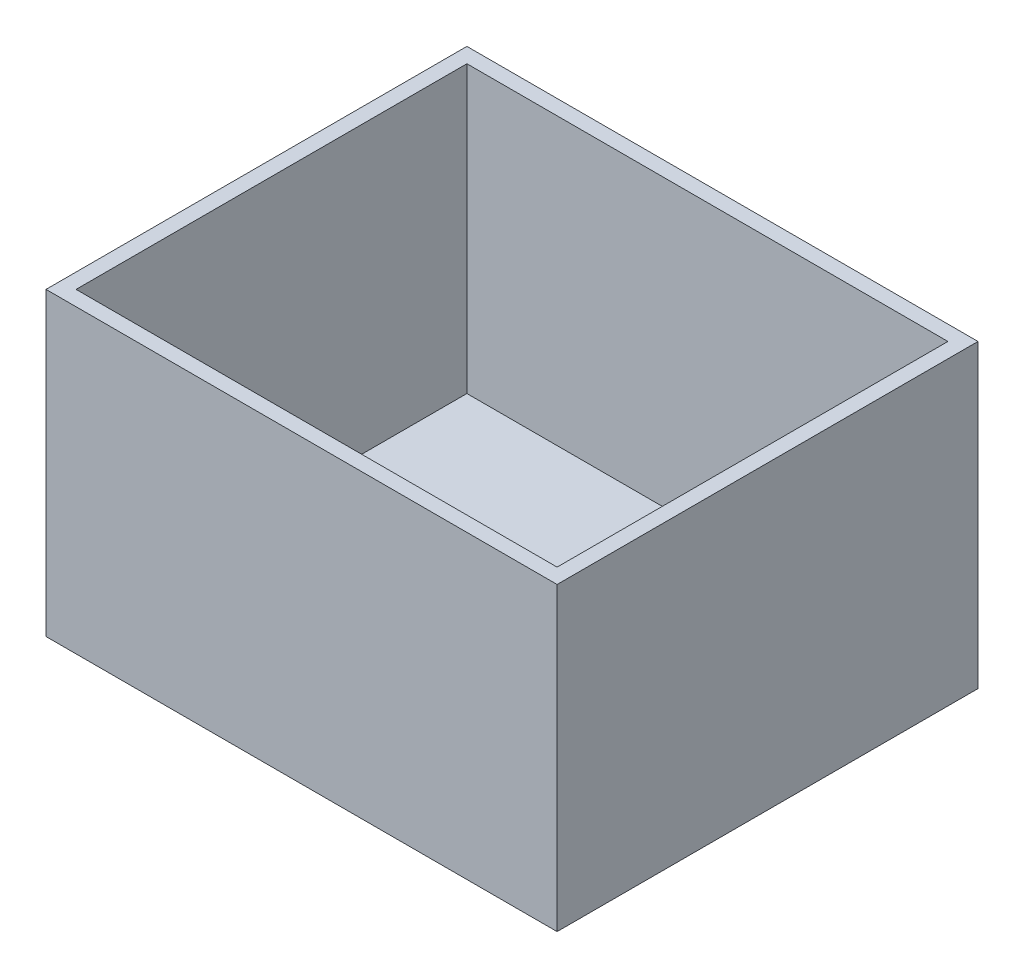
ISO-10303-21;
HEADER;
FILE_DESCRIPTION(('STEP AP214'),'2;1');
FILE_NAME('part.step','',(''),(''),'','','');
FILE_SCHEMA(('AUTOMOTIVE_DESIGN { 1 0 10303 214 1 1 1 1 }'));
ENDSEC;
DATA;
#1=APPLICATION_CONTEXT('core data for automotive mechanical design processes');
#2=APPLICATION_PROTOCOL_DEFINITION('international standard','automotive_design',2000,#1);
#3=PRODUCT_CONTEXT('',#1,'mechanical');
#4=PRODUCT('Part','Part','',(#3));
#5=PRODUCT_RELATED_PRODUCT_CATEGORY('part','',(#4));
#6=PRODUCT_DEFINITION_FORMATION('','',#4);
#7=PRODUCT_DEFINITION_CONTEXT('part definition',#1,'design');
#8=PRODUCT_DEFINITION('design','',#6,#7);
#9=PRODUCT_DEFINITION_SHAPE('','',#8);
#10=(LENGTH_UNIT() NAMED_UNIT(*) SI_UNIT(.MILLI.,.METRE.));
#11=(NAMED_UNIT(*) PLANE_ANGLE_UNIT() SI_UNIT($,.RADIAN.));
#12=(NAMED_UNIT(*) SI_UNIT($,.STERADIAN.) SOLID_ANGLE_UNIT());
#13=UNCERTAINTY_MEASURE_WITH_UNIT(LENGTH_MEASURE(1.E-05),#10,'distance_accuracy_value','');
#14=(GEOMETRIC_REPRESENTATION_CONTEXT(3) GLOBAL_UNCERTAINTY_ASSIGNED_CONTEXT((#13)) GLOBAL_UNIT_ASSIGNED_CONTEXT((#10,
#11,#12)) REPRESENTATION_CONTEXT('',''));
#15=CARTESIAN_POINT('',(0.,0.,0.));
#16=DIRECTION('',(0.,0.,1.));
#17=DIRECTION('',(1.,0.,0.));
#18=AXIS2_PLACEMENT_3D('',#15,#16,#17);
#19=CARTESIAN_POINT('',(0.,50.8,0.));
#20=DIRECTION('',(0.,0.,-1.));
#21=DIRECTION('',(-1.,0.,0.));
#22=AXIS2_PLACEMENT_3D('',#19,#20,#21);
#23=PLANE('',#22);
#24=DIRECTION('',(1.,0.,0.));
#25=VECTOR('',#24,1.);
#26=CARTESIAN_POINT('',(0.,0.,0.));
#27=LINE('',#26,#25);
#28=CARTESIAN_POINT('',(0.,0.,0.));
#29=VERTEX_POINT('',#28);
#30=CARTESIAN_POINT('',(86.36,0.,0.));
#31=VERTEX_POINT('',#30);
#32=EDGE_CURVE('E147',#29,#31,#27,.T.);
#33=ORIENTED_EDGE('',*,*,#32,.T.);
#34=DIRECTION('',(0.,-1.,0.));
#35=VECTOR('',#34,1.);
#36=CARTESIAN_POINT('',(86.36,50.8,0.));
#37=LINE('',#36,#35);
#38=CARTESIAN_POINT('',(86.36,50.8,0.));
#39=VERTEX_POINT('',#38);
#40=EDGE_CURVE('E11',#39,#31,#37,.T.);
#41=ORIENTED_EDGE('',*,*,#40,.F.);
#42=DIRECTION('',(1.,0.,0.));
#43=VECTOR('',#42,1.);
#44=CARTESIAN_POINT('',(0.,50.8,0.));
#45=LINE('',#44,#43);
#46=CARTESIAN_POINT('',(0.,50.8,0.));
#47=VERTEX_POINT('',#46);
#48=EDGE_CURVE('E151',#47,#39,#45,.T.);
#49=ORIENTED_EDGE('',*,*,#48,.F.);
#50=DIRECTION('',(0.,-1.,0.));
#51=VECTOR('',#50,1.);
#52=CARTESIAN_POINT('',(0.,50.8,0.));
#53=LINE('',#52,#51);
#54=EDGE_CURVE('E59',#47,#29,#53,.T.);
#55=ORIENTED_EDGE('',*,*,#54,.T.);
#56=EDGE_LOOP('',(#33,#41,#49,#55));
#57=FACE_BOUND('',#56,.T.);
#58=ADVANCED_FACE('F36',(#57),#23,.F.);
#59=CARTESIAN_POINT('',(86.36,50.8,0.));
#60=DIRECTION('',(-1.,0.,0.));
#61=DIRECTION('',(0.,0.,1.));
#62=AXIS2_PLACEMENT_3D('',#59,#60,#61);
#63=PLANE('',#62);
#64=DIRECTION('',(0.,0.,-1.));
#65=VECTOR('',#64,1.);
#66=CARTESIAN_POINT('',(86.36,0.,0.));
#67=LINE('',#66,#65);
#68=CARTESIAN_POINT('',(86.36,0.,-71.12));
#69=VERTEX_POINT('',#68);
#70=EDGE_CURVE('E161',#31,#69,#67,.T.);
#71=ORIENTED_EDGE('',*,*,#70,.T.);
#72=DIRECTION('',(0.,-1.,0.));
#73=VECTOR('',#72,1.);
#74=CARTESIAN_POINT('',(86.36,50.8,-71.12));
#75=LINE('',#74,#73);
#76=CARTESIAN_POINT('',(86.36,50.8,-71.12));
#77=VERTEX_POINT('',#76);
#78=EDGE_CURVE('E43',#77,#69,#75,.T.);
#79=ORIENTED_EDGE('',*,*,#78,.F.);
#80=DIRECTION('',(0.,0.,-1.));
#81=VECTOR('',#80,1.);
#82=CARTESIAN_POINT('',(86.36,50.8,0.));
#83=LINE('',#82,#81);
#84=EDGE_CURVE('E85',#39,#77,#83,.T.);
#85=ORIENTED_EDGE('',*,*,#84,.F.);
#86=ORIENTED_EDGE('',*,*,#40,.T.);
#87=EDGE_LOOP('',(#71,#79,#85,#86));
#88=FACE_BOUND('',#87,.T.);
#89=ADVANCED_FACE('F175',(#88),#63,.F.);
#90=CARTESIAN_POINT('',(0.,50.8,-71.12));
#91=DIRECTION('',(0.,0.,-1.));
#92=DIRECTION('',(-1.,0.,0.));
#93=AXIS2_PLACEMENT_3D('',#90,#91,#92);
#94=PLANE('',#93);
#95=DIRECTION('',(1.,0.,0.));
#96=VECTOR('',#95,1.);
#97=CARTESIAN_POINT('',(0.,0.,-71.12));
#98=LINE('',#97,#96);
#99=CARTESIAN_POINT('',(0.,0.,-71.12));
#100=VERTEX_POINT('',#99);
#101=EDGE_CURVE('E164',#100,#69,#98,.T.);
#102=ORIENTED_EDGE('',*,*,#101,.F.);
#103=DIRECTION('',(0.,-1.,0.));
#104=VECTOR('',#103,1.);
#105=CARTESIAN_POINT('',(0.,50.8,-71.12));
#106=LINE('',#105,#104);
#107=CARTESIAN_POINT('',(0.,50.8,-71.12));
#108=VERTEX_POINT('',#107);
#109=EDGE_CURVE('E170',#108,#100,#106,.T.);
#110=ORIENTED_EDGE('',*,*,#109,.F.);
#111=DIRECTION('',(1.,0.,0.));
#112=VECTOR('',#111,1.);
#113=CARTESIAN_POINT('',(0.,50.8,-71.12));
#114=LINE('',#113,#112);
#115=EDGE_CURVE('E155',#108,#77,#114,.T.);
#116=ORIENTED_EDGE('',*,*,#115,.T.);
#117=ORIENTED_EDGE('',*,*,#78,.T.);
#118=EDGE_LOOP('',(#102,#110,#116,#117));
#119=FACE_BOUND('',#118,.T.);
#120=ADVANCED_FACE('F173',(#119),#94,.T.);
#121=CARTESIAN_POINT('',(0.,50.8,0.));
#122=DIRECTION('',(-1.,0.,0.));
#123=DIRECTION('',(0.,0.,1.));
#124=AXIS2_PLACEMENT_3D('',#121,#122,#123);
#125=PLANE('',#124);
#126=DIRECTION('',(0.,0.,-1.));
#127=VECTOR('',#126,1.);
#128=CARTESIAN_POINT('',(0.,0.,0.));
#129=LINE('',#128,#127);
#130=EDGE_CURVE('E153',#29,#100,#129,.T.);
#131=ORIENTED_EDGE('',*,*,#130,.F.);
#132=ORIENTED_EDGE('',*,*,#54,.F.);
#133=DIRECTION('',(0.,0.,-1.));
#134=VECTOR('',#133,1.);
#135=CARTESIAN_POINT('',(0.,50.8,0.));
#136=LINE('',#135,#134);
#137=EDGE_CURVE('E158',#47,#108,#136,.T.);
#138=ORIENTED_EDGE('',*,*,#137,.T.);
#139=ORIENTED_EDGE('',*,*,#109,.T.);
#140=EDGE_LOOP('',(#131,#132,#138,#139));
#141=FACE_BOUND('',#140,.T.);
#142=ADVANCED_FACE('F179',(#141),#125,.T.);
#143=CARTESIAN_POINT('',(0.,50.8,0.));
#144=DIRECTION('',(0.,1.,0.));
#145=DIRECTION('',(0.,0.,1.));
#146=AXIS2_PLACEMENT_3D('',#143,#144,#145);
#147=PLANE('',#146);
#148=DIRECTION('',(0.,0.,1.));
#149=VECTOR('',#148,1.);
#150=CARTESIAN_POINT('',(2.54,50.8,-68.58));
#151=LINE('',#150,#149);
#152=CARTESIAN_POINT('',(2.54,50.8,-68.58));
#153=VERTEX_POINT('',#152);
#154=CARTESIAN_POINT('',(2.54000000000001,50.8,-2.53999999999999));
#155=VERTEX_POINT('',#154);
#156=EDGE_CURVE('E50',#153,#155,#151,.T.);
#157=ORIENTED_EDGE('',*,*,#156,.F.);
#158=DIRECTION('',(-1.,0.,0.));
#159=VECTOR('',#158,1.);
#160=CARTESIAN_POINT('',(2.54,50.8,-68.58));
#161=LINE('',#160,#159);
#162=CARTESIAN_POINT('',(83.82,50.8,-68.58));
#163=VERTEX_POINT('',#162);
#164=EDGE_CURVE('E128',#163,#153,#161,.T.);
#165=ORIENTED_EDGE('',*,*,#164,.F.);
#166=DIRECTION('',(0.,0.,-1.));
#167=VECTOR('',#166,1.);
#168=CARTESIAN_POINT('',(83.82,50.8,-68.58));
#169=LINE('',#168,#167);
#170=CARTESIAN_POINT('',(83.82,50.8,-2.53999999999999));
#171=VERTEX_POINT('',#170);
#172=EDGE_CURVE('E131',#171,#163,#169,.T.);
#173=ORIENTED_EDGE('',*,*,#172,.F.);
#174=DIRECTION('',(1.,0.,0.));
#175=VECTOR('',#174,1.);
#176=CARTESIAN_POINT('',(2.54000000000001,50.8,-2.53999999999999));
#177=LINE('',#176,#175);
#178=EDGE_CURVE('E140',#155,#171,#177,.T.);
#179=ORIENTED_EDGE('',*,*,#178,.F.);
#180=EDGE_LOOP('',(#157,#165,#173,#179));
#181=FACE_BOUND('',#180,.T.);
#182=ORIENTED_EDGE('',*,*,#48,.T.);
#183=ORIENTED_EDGE('',*,*,#84,.T.);
#184=ORIENTED_EDGE('',*,*,#115,.F.);
#185=ORIENTED_EDGE('',*,*,#137,.F.);
#186=EDGE_LOOP('',(#182,#183,#184,#185));
#187=FACE_BOUND('',#186,.T.);
#188=ADVANCED_FACE('F182',(#181,#187),#147,.T.);
#189=CARTESIAN_POINT('',(0.,0.,0.));
#190=DIRECTION('',(0.,1.,0.));
#191=DIRECTION('',(0.,0.,1.));
#192=AXIS2_PLACEMENT_3D('',#189,#190,#191);
#193=PLANE('',#192);
#194=ORIENTED_EDGE('',*,*,#32,.F.);
#195=ORIENTED_EDGE('',*,*,#130,.T.);
#196=ORIENTED_EDGE('',*,*,#101,.T.);
#197=ORIENTED_EDGE('',*,*,#70,.F.);
#198=EDGE_LOOP('',(#194,#195,#196,#197));
#199=FACE_BOUND('',#198,.T.);
#200=ADVANCED_FACE('F178',(#199),#193,.F.);
#201=CARTESIAN_POINT('',(2.54,2.54,-68.58));
#202=DIRECTION('',(-1.,0.,0.));
#203=DIRECTION('',(0.,0.,1.));
#204=AXIS2_PLACEMENT_3D('',#201,#202,#203);
#205=PLANE('',#204);
#206=ORIENTED_EDGE('',*,*,#156,.T.);
#207=DIRECTION('',(0.,1.,0.));
#208=VECTOR('',#207,1.);
#209=CARTESIAN_POINT('',(2.54000000000001,2.54,-2.53999999999999));
#210=LINE('',#209,#208);
#211=CARTESIAN_POINT('',(2.54000000000001,2.54,-2.53999999999999));
#212=VERTEX_POINT('',#211);
#213=EDGE_CURVE('E106',#212,#155,#210,.T.);
#214=ORIENTED_EDGE('',*,*,#213,.F.);
#215=DIRECTION('',(0.,0.,1.));
#216=VECTOR('',#215,1.);
#217=CARTESIAN_POINT('',(2.54,2.54,-68.58));
#218=LINE('',#217,#216);
#219=CARTESIAN_POINT('',(2.54,2.54,-68.58));
#220=VERTEX_POINT('',#219);
#221=EDGE_CURVE('E110',#220,#212,#218,.T.);
#222=ORIENTED_EDGE('',*,*,#221,.F.);
#223=DIRECTION('',(0.,1.,0.));
#224=VECTOR('',#223,1.);
#225=CARTESIAN_POINT('',(2.54,2.54,-68.58));
#226=LINE('',#225,#224);
#227=EDGE_CURVE('E145',#220,#153,#226,.T.);
#228=ORIENTED_EDGE('',*,*,#227,.T.);
#229=EDGE_LOOP('',(#206,#214,#222,#228));
#230=FACE_BOUND('',#229,.T.);
#231=ADVANCED_FACE('F108',(#230),#205,.F.);
#232=CARTESIAN_POINT('',(2.54,2.54,-68.58));
#233=DIRECTION('',(0.,0.,-1.));
#234=DIRECTION('',(-1.,0.,0.));
#235=AXIS2_PLACEMENT_3D('',#232,#233,#234);
#236=PLANE('',#235);
#237=ORIENTED_EDGE('',*,*,#164,.T.);
#238=ORIENTED_EDGE('',*,*,#227,.F.);
#239=DIRECTION('',(-1.,0.,0.));
#240=VECTOR('',#239,1.);
#241=CARTESIAN_POINT('',(2.54,2.54,-68.58));
#242=LINE('',#241,#240);
#243=CARTESIAN_POINT('',(83.82,2.54,-68.58));
#244=VERTEX_POINT('',#243);
#245=EDGE_CURVE('E116',#244,#220,#242,.T.);
#246=ORIENTED_EDGE('',*,*,#245,.F.);
#247=DIRECTION('',(0.,1.,0.));
#248=VECTOR('',#247,1.);
#249=CARTESIAN_POINT('',(83.82,2.54,-68.58));
#250=LINE('',#249,#248);
#251=EDGE_CURVE('E148',#244,#163,#250,.T.);
#252=ORIENTED_EDGE('',*,*,#251,.T.);
#253=EDGE_LOOP('',(#237,#238,#246,#252));
#254=FACE_BOUND('',#253,.T.);
#255=ADVANCED_FACE('F201',(#254),#236,.F.);
#256=CARTESIAN_POINT('',(83.82,2.54,-68.58));
#257=DIRECTION('',(1.,0.,0.));
#258=DIRECTION('',(0.,0.,-1.));
#259=AXIS2_PLACEMENT_3D('',#256,#257,#258);
#260=PLANE('',#259);
#261=ORIENTED_EDGE('',*,*,#172,.T.);
#262=ORIENTED_EDGE('',*,*,#251,.F.);
#263=DIRECTION('',(0.,0.,-1.));
#264=VECTOR('',#263,1.);
#265=CARTESIAN_POINT('',(83.82,2.54,-68.58));
#266=LINE('',#265,#264);
#267=CARTESIAN_POINT('',(83.82,2.54,-2.53999999999999));
#268=VERTEX_POINT('',#267);
#269=EDGE_CURVE('E124',#268,#244,#266,.T.);
#270=ORIENTED_EDGE('',*,*,#269,.F.);
#271=DIRECTION('',(0.,1.,0.));
#272=VECTOR('',#271,1.);
#273=CARTESIAN_POINT('',(83.82,2.54,-2.53999999999999));
#274=LINE('',#273,#272);
#275=EDGE_CURVE('E115',#268,#171,#274,.T.);
#276=ORIENTED_EDGE('',*,*,#275,.T.);
#277=EDGE_LOOP('',(#261,#262,#270,#276));
#278=FACE_BOUND('',#277,.T.);
#279=ADVANCED_FACE('F204',(#278),#260,.F.);
#280=CARTESIAN_POINT('',(2.54000000000001,2.54,-2.53999999999999));
#281=DIRECTION('',(0.,0.,1.));
#282=DIRECTION('',(1.,0.,0.));
#283=AXIS2_PLACEMENT_3D('',#280,#281,#282);
#284=PLANE('',#283);
#285=ORIENTED_EDGE('',*,*,#178,.T.);
#286=ORIENTED_EDGE('',*,*,#275,.F.);
#287=DIRECTION('',(1.,0.,0.));
#288=VECTOR('',#287,1.);
#289=CARTESIAN_POINT('',(2.54000000000001,2.54,-2.53999999999999));
#290=LINE('',#289,#288);
#291=EDGE_CURVE('E119',#212,#268,#290,.T.);
#292=ORIENTED_EDGE('',*,*,#291,.F.);
#293=ORIENTED_EDGE('',*,*,#213,.T.);
#294=EDGE_LOOP('',(#285,#286,#292,#293));
#295=FACE_BOUND('',#294,.T.);
#296=ADVANCED_FACE('F120',(#295),#284,.F.);
#297=CARTESIAN_POINT('',(0.,2.54,0.));
#298=DIRECTION('',(0.,1.,0.));
#299=DIRECTION('',(0.,0.,1.));
#300=AXIS2_PLACEMENT_3D('',#297,#298,#299);
#301=PLANE('',#300);
#302=CARTESIAN_POINT('',(27.94,2.54,-6.34999999999999));
#303=DIRECTION('',(0.,1.,0.));
#304=DIRECTION('',(0.,0.,1.));
#305=AXIS2_PLACEMENT_3D('',#302,#303,#304);
#306=CIRCLE('',#305,1.524);
#307=CARTESIAN_POINT('',(27.94,2.54,-4.82599999999999));
#308=VERTEX_POINT('',#307);
#309=EDGE_CURVE('E251',#308,#308,#306,.T.);
#310=ORIENTED_EDGE('',*,*,#309,.F.);
#311=EDGE_LOOP('',(#310));
#312=FACE_BOUND('',#311,.T.);
#313=CARTESIAN_POINT('',(63.5,2.54,-6.34999999999999));
#314=DIRECTION('',(0.,1.,0.));
#315=DIRECTION('',(0.,0.,1.));
#316=AXIS2_PLACEMENT_3D('',#313,#314,#315);
#317=CIRCLE('',#316,1.52399999999999);
#318=CARTESIAN_POINT('',(63.5,2.54,-4.82599999999999));
#319=VERTEX_POINT('',#318);
#320=EDGE_CURVE('E250',#319,#319,#317,.T.);
#321=ORIENTED_EDGE('',*,*,#320,.F.);
#322=EDGE_LOOP('',(#321));
#323=FACE_BOUND('',#322,.T.);
#324=CARTESIAN_POINT('',(63.5,2.54,-36.576));
#325=DIRECTION('',(0.,1.,0.));
#326=DIRECTION('',(0.,0.,1.));
#327=AXIS2_PLACEMENT_3D('',#324,#325,#326);
#328=CIRCLE('',#327,1.52399999999999);
#329=CARTESIAN_POINT('',(63.5,2.54,-35.052));
#330=VERTEX_POINT('',#329);
#331=EDGE_CURVE('E260',#330,#330,#328,.T.);
#332=ORIENTED_EDGE('',*,*,#331,.F.);
#333=EDGE_LOOP('',(#332));
#334=FACE_BOUND('',#333,.T.);
#335=CARTESIAN_POINT('',(27.94,2.54,-36.576));
#336=DIRECTION('',(0.,1.,0.));
#337=DIRECTION('',(0.,0.,1.));
#338=AXIS2_PLACEMENT_3D('',#335,#336,#337);
#339=CIRCLE('',#338,1.524);
#340=CARTESIAN_POINT('',(27.94,2.54,-35.052));
#341=VERTEX_POINT('',#340);
#342=EDGE_CURVE('E134',#341,#341,#339,.T.);
#343=ORIENTED_EDGE('',*,*,#342,.F.);
#344=EDGE_LOOP('',(#343));
#345=FACE_BOUND('',#344,.T.);
#346=ORIENTED_EDGE('',*,*,#221,.T.);
#347=ORIENTED_EDGE('',*,*,#291,.T.);
#348=ORIENTED_EDGE('',*,*,#269,.T.);
#349=ORIENTED_EDGE('',*,*,#245,.T.);
#350=EDGE_LOOP('',(#346,#347,#348,#349));
#351=FACE_BOUND('',#350,.T.);
#352=ADVANCED_FACE('F126',(#312,#323,#334,#345,#351),#301,.T.);
#353=CARTESIAN_POINT('',(27.94,8.89,-36.576));
#354=DIRECTION('',(0.,-1.,0.));
#355=DIRECTION('',(0.,0.,-1.));
#356=AXIS2_PLACEMENT_3D('',#353,#354,#355);
#357=CYLINDRICAL_SURFACE('',#356,1.524);
#358=CARTESIAN_POINT('',(27.94,8.89,-36.576));
#359=DIRECTION('',(0.,1.,0.));
#360=DIRECTION('',(0.,0.,1.));
#361=AXIS2_PLACEMENT_3D('',#358,#359,#360);
#362=CIRCLE('',#361,1.524);
#363=CARTESIAN_POINT('',(27.94,8.89,-35.052));
#364=VERTEX_POINT('',#363);
#365=EDGE_CURVE('E141',#364,#364,#362,.T.);
#366=ORIENTED_EDGE('',*,*,#365,.F.);
#367=EDGE_LOOP('',(#366));
#368=FACE_BOUND('',#367,.T.);
#369=ORIENTED_EDGE('',*,*,#342,.T.);
#370=EDGE_LOOP('',(#369));
#371=FACE_BOUND('',#370,.T.);
#372=ADVANCED_FACE('F213',(#368,#371),#357,.T.);
#373=CARTESIAN_POINT('',(27.94,8.89,-36.576));
#374=DIRECTION('',(0.,1.,0.));
#375=DIRECTION('',(0.,0.,1.));
#376=AXIS2_PLACEMENT_3D('',#373,#374,#375);
#377=PLANE('',#376);
#378=ORIENTED_EDGE('',*,*,#365,.T.);
#379=EDGE_LOOP('',(#378));
#380=FACE_BOUND('',#379,.T.);
#381=ADVANCED_FACE('F217',(#380),#377,.T.);
#382=CARTESIAN_POINT('',(63.5,8.89,-36.576));
#383=DIRECTION('',(0.,-1.,0.));
#384=DIRECTION('',(0.,0.,-1.));
#385=AXIS2_PLACEMENT_3D('',#382,#383,#384);
#386=CYLINDRICAL_SURFACE('',#385,1.52399999999999);
#387=CARTESIAN_POINT('',(63.5,8.89,-36.576));
#388=DIRECTION('',(0.,1.,0.));
#389=DIRECTION('',(0.,0.,1.));
#390=AXIS2_PLACEMENT_3D('',#387,#388,#389);
#391=CIRCLE('',#390,1.52399999999999);
#392=CARTESIAN_POINT('',(63.5,8.89,-35.052));
#393=VERTEX_POINT('',#392);
#394=EDGE_CURVE('E262',#393,#393,#391,.T.);
#395=ORIENTED_EDGE('',*,*,#394,.F.);
#396=EDGE_LOOP('',(#395));
#397=FACE_BOUND('',#396,.T.);
#398=ORIENTED_EDGE('',*,*,#331,.T.);
#399=EDGE_LOOP('',(#398));
#400=FACE_BOUND('',#399,.T.);
#401=ADVANCED_FACE('F221',(#397,#400),#386,.T.);
#402=CARTESIAN_POINT('',(63.5,8.89,-36.576));
#403=DIRECTION('',(0.,1.,0.));
#404=DIRECTION('',(0.,0.,1.));
#405=AXIS2_PLACEMENT_3D('',#402,#403,#404);
#406=PLANE('',#405);
#407=ORIENTED_EDGE('',*,*,#394,.T.);
#408=EDGE_LOOP('',(#407));
#409=FACE_BOUND('',#408,.T.);
#410=ADVANCED_FACE('F225',(#409),#406,.T.);
#411=CARTESIAN_POINT('',(63.5,8.89,-6.34999999999999));
#412=DIRECTION('',(0.,-1.,0.));
#413=DIRECTION('',(0.,0.,-1.));
#414=AXIS2_PLACEMENT_3D('',#411,#412,#413);
#415=CYLINDRICAL_SURFACE('',#414,1.52399999999999);
#416=CARTESIAN_POINT('',(63.5,8.89,-6.34999999999999));
#417=DIRECTION('',(0.,1.,0.));
#418=DIRECTION('',(0.,0.,1.));
#419=AXIS2_PLACEMENT_3D('',#416,#417,#418);
#420=CIRCLE('',#419,1.52399999999999);
#421=CARTESIAN_POINT('',(63.5,8.89,-4.82599999999999));
#422=VERTEX_POINT('',#421);
#423=EDGE_CURVE('E254',#422,#422,#420,.T.);
#424=ORIENTED_EDGE('',*,*,#423,.F.);
#425=EDGE_LOOP('',(#424));
#426=FACE_BOUND('',#425,.T.);
#427=ORIENTED_EDGE('',*,*,#320,.T.);
#428=EDGE_LOOP('',(#427));
#429=FACE_BOUND('',#428,.T.);
#430=ADVANCED_FACE('F229',(#426,#429),#415,.T.);
#431=CARTESIAN_POINT('',(63.5,8.89,-6.34999999999999));
#432=DIRECTION('',(0.,1.,0.));
#433=DIRECTION('',(0.,0.,1.));
#434=AXIS2_PLACEMENT_3D('',#431,#432,#433);
#435=PLANE('',#434);
#436=ORIENTED_EDGE('',*,*,#423,.T.);
#437=EDGE_LOOP('',(#436));
#438=FACE_BOUND('',#437,.T.);
#439=ADVANCED_FACE('F233',(#438),#435,.T.);
#440=CARTESIAN_POINT('',(27.94,8.89,-6.34999999999999));
#441=DIRECTION('',(0.,-1.,0.));
#442=DIRECTION('',(0.,0.,-1.));
#443=AXIS2_PLACEMENT_3D('',#440,#441,#442);
#444=CYLINDRICAL_SURFACE('',#443,1.524);
#445=CARTESIAN_POINT('',(27.94,8.89,-6.34999999999999));
#446=DIRECTION('',(0.,1.,0.));
#447=DIRECTION('',(0.,0.,1.));
#448=AXIS2_PLACEMENT_3D('',#445,#446,#447);
#449=CIRCLE('',#448,1.524);
#450=CARTESIAN_POINT('',(27.94,8.89,-4.82599999999999));
#451=VERTEX_POINT('',#450);
#452=EDGE_CURVE('E249',#451,#451,#449,.T.);
#453=ORIENTED_EDGE('',*,*,#452,.F.);
#454=EDGE_LOOP('',(#453));
#455=FACE_BOUND('',#454,.T.);
#456=ORIENTED_EDGE('',*,*,#309,.T.);
#457=EDGE_LOOP('',(#456));
#458=FACE_BOUND('',#457,.T.);
#459=ADVANCED_FACE('F237',(#455,#458),#444,.T.);
#460=CARTESIAN_POINT('',(27.94,8.89,-6.34999999999999));
#461=DIRECTION('',(0.,1.,0.));
#462=DIRECTION('',(0.,0.,1.));
#463=AXIS2_PLACEMENT_3D('',#460,#461,#462);
#464=PLANE('',#463);
#465=ORIENTED_EDGE('',*,*,#452,.T.);
#466=EDGE_LOOP('',(#465));
#467=FACE_BOUND('',#466,.T.);
#468=ADVANCED_FACE('F241',(#467),#464,.T.);
#469=CLOSED_SHELL('',(#58,#89,#120,#142,#188,#200,#231,#255,#279,#296,#352,#372,#381,#401,#410,
#430,#439,#459,#468));
#470=MANIFOLD_SOLID_BREP('B2',#469);
#471=ADVANCED_BREP_SHAPE_REPRESENTATION('',(#18,#470),#14);
#472=SHAPE_DEFINITION_REPRESENTATION(#9,#471);
ENDSEC;
END-ISO-10303-21;
